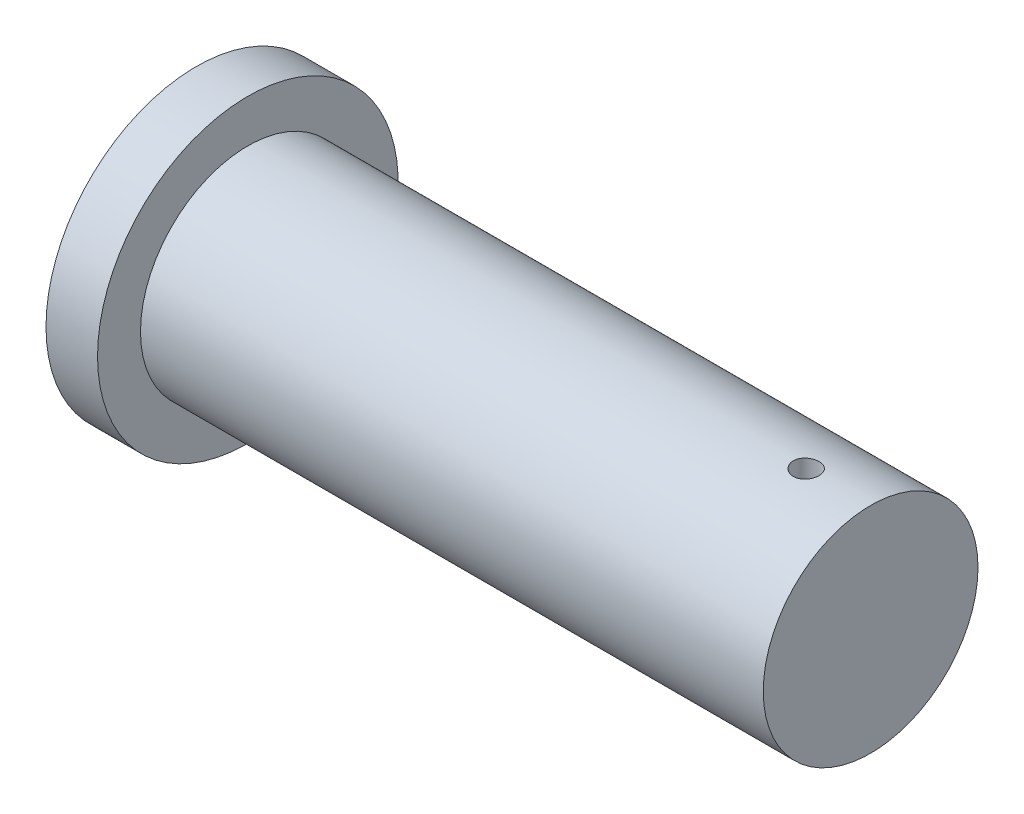
ISO-10303-21;
HEADER;
FILE_DESCRIPTION(('STEP AP214'),'2;1');
FILE_NAME('part.step','',(''),(''),'','','');
FILE_SCHEMA(('AUTOMOTIVE_DESIGN { 1 0 10303 214 1 1 1 1 }'));
ENDSEC;
DATA;
#1=APPLICATION_CONTEXT('core data for automotive mechanical design processes');
#2=APPLICATION_PROTOCOL_DEFINITION('international standard','automotive_design',2000,#1);
#3=PRODUCT_CONTEXT('',#1,'mechanical');
#4=PRODUCT('Part','Part','',(#3));
#5=PRODUCT_RELATED_PRODUCT_CATEGORY('part','',(#4));
#6=PRODUCT_DEFINITION_FORMATION('','',#4);
#7=PRODUCT_DEFINITION_CONTEXT('part definition',#1,'design');
#8=PRODUCT_DEFINITION('design','',#6,#7);
#9=PRODUCT_DEFINITION_SHAPE('','',#8);
#10=(LENGTH_UNIT() NAMED_UNIT(*) SI_UNIT(.MILLI.,.METRE.));
#11=(NAMED_UNIT(*) PLANE_ANGLE_UNIT() SI_UNIT($,.RADIAN.));
#12=(NAMED_UNIT(*) SI_UNIT($,.STERADIAN.) SOLID_ANGLE_UNIT());
#13=UNCERTAINTY_MEASURE_WITH_UNIT(LENGTH_MEASURE(1.E-05),#10,'distance_accuracy_value','');
#14=(GEOMETRIC_REPRESENTATION_CONTEXT(3) GLOBAL_UNCERTAINTY_ASSIGNED_CONTEXT((#13)) GLOBAL_UNIT_ASSIGNED_CONTEXT((#10,
#11,#12)) REPRESENTATION_CONTEXT('',''));
#15=CARTESIAN_POINT('',(0.,0.,0.));
#16=DIRECTION('',(0.,0.,1.));
#17=DIRECTION('',(1.,0.,0.));
#18=AXIS2_PLACEMENT_3D('',#15,#16,#17);
#19=CARTESIAN_POINT('',(-157.,35.,0.));
#20=DIRECTION('',(1.,0.,0.));
#21=DIRECTION('',(0.,0.,-1.));
#22=AXIS2_PLACEMENT_3D('',#19,#20,#21);
#23=PLANE('',#22);
#24=CARTESIAN_POINT('',(-157.,0.,0.));
#25=DIRECTION('',(-1.,0.,0.));
#26=DIRECTION('',(0.,0.,1.));
#27=AXIS2_PLACEMENT_3D('',#24,#25,#26);
#28=CIRCLE('',#27,35.);
#29=CARTESIAN_POINT('',(-157.,0.,35.));
#30=VERTEX_POINT('',#29);
#31=EDGE_CURVE('E90',#30,#30,#28,.T.);
#32=ORIENTED_EDGE('',*,*,#31,.T.);
#33=EDGE_LOOP('',(#32));
#34=FACE_BOUND('',#33,.T.);
#35=ADVANCED_FACE('F35',(#34),#23,.F.);
#36=CARTESIAN_POINT('',(0.,0.,0.));
#37=DIRECTION('',(-1.,0.,0.));
#38=DIRECTION('',(0.,0.,1.));
#39=AXIS2_PLACEMENT_3D('',#36,#37,#38);
#40=PLANE('',#39);
#41=CARTESIAN_POINT('',(0.,0.,0.));
#42=DIRECTION('',(-1.,0.,0.));
#43=DIRECTION('',(0.,0.,1.));
#44=AXIS2_PLACEMENT_3D('',#41,#42,#43);
#45=CIRCLE('',#44,25.);
#46=CARTESIAN_POINT('',(0.,0.,25.));
#47=VERTEX_POINT('',#46);
#48=EDGE_CURVE('E10',#47,#47,#45,.T.);
#49=ORIENTED_EDGE('',*,*,#48,.F.);
#50=EDGE_LOOP('',(#49));
#51=FACE_BOUND('',#50,.T.);
#52=ADVANCED_FACE('F78',(#51),#40,.F.);
#53=CARTESIAN_POINT('',(-157.,0.,0.));
#54=DIRECTION('',(-1.,0.,0.));
#55=DIRECTION('',(0.,0.,1.));
#56=AXIS2_PLACEMENT_3D('',#53,#54,#55);
#57=CYLINDRICAL_SURFACE('',#56,25.);
#58=CARTESIAN_POINT('',(-15.,-24.8193472919817,3.));
#59=CARTESIAN_POINT('',(-14.8321408588001,-24.819349617552,2.99999283172714));
#60=CARTESIAN_POINT('',(-14.6641754798501,-24.8210685774632,2.98586413495824));
#61=CARTESIAN_POINT('',(-14.3329153879421,-24.8277564496115,2.92972318709126));
#62=CARTESIAN_POINT('',(-14.1696258043137,-24.8327287982131,2.88768145238964));
#63=CARTESIAN_POINT('',(-13.8525615944955,-24.8453523109071,2.77696834616031));
#64=CARTESIAN_POINT('',(-13.6987807388663,-24.8530016988387,2.708314627898));
#65=CARTESIAN_POINT('',(-13.4049528578965,-24.8701152498661,2.5463633755789));
#66=CARTESIAN_POINT('',(-13.2649034084314,-24.8795790917656,2.45307020212001));
#67=CARTESIAN_POINT('',(-13.0017602283905,-24.8993100054925,2.24397143930053));
#68=CARTESIAN_POINT('',(-12.8787477056516,-24.9095805816582,2.1280639725065));
#69=CARTESIAN_POINT('',(-12.6538712818379,-24.9297361585383,1.87724586434875));
#70=CARTESIAN_POINT('',(-12.5520084140581,-24.9396211403948,1.74233429505413));
#71=CARTESIAN_POINT('',(-12.3720334670638,-24.9579274023081,1.45682956846799));
#72=CARTESIAN_POINT('',(-12.2939945842604,-24.9663441380671,1.30618995384899));
#73=CARTESIAN_POINT('',(-12.1643515396152,-24.9807271243236,0.993825767272774));
#74=CARTESIAN_POINT('',(-12.1127464702523,-24.9866934589465,0.832101576085541));
#75=CARTESIAN_POINT('',(-12.0376777438965,-24.9954787324527,0.502987856985083));
#76=CARTESIAN_POINT('',(-12.0140793465542,-24.9983127364408,0.335629471043379));
#77=CARTESIAN_POINT('',(-11.9952764006895,-25.0005654366101,-0.000694496668565301));
#78=CARTESIAN_POINT('',(-12.0000708178418,-24.9999842572034,-0.169660019668339));
#79=CARTESIAN_POINT('',(-12.0378091218513,-24.9954842925266,-0.50348566751753));
#80=CARTESIAN_POINT('',(-12.0706081049724,-24.9915826884338,-0.668362437568212));
#81=CARTESIAN_POINT('',(-12.163198151716,-24.9808996422381,-0.990254370091176));
#82=CARTESIAN_POINT('',(-12.2229896941816,-24.9741181490466,-1.1472693930426));
#83=CARTESIAN_POINT('',(-12.3680227289065,-24.9584077904553,-1.44943112325937));
#84=CARTESIAN_POINT('',(-12.4533272360064,-24.9494736188692,-1.59454729727538));
#85=CARTESIAN_POINT('',(-12.6469188989561,-24.9304580967161,-1.86845892019878));
#86=CARTESIAN_POINT('',(-12.7552070264156,-24.9203766976596,-1.99725367876689));
#87=CARTESIAN_POINT('',(-12.9925043495404,-24.9001206745296,-2.23571721123049));
#88=CARTESIAN_POINT('',(-13.1216397813735,-24.8899458632542,-2.34526038878379));
#89=CARTESIAN_POINT('',(-13.3965315136795,-24.8707126046074,-2.54113591825157));
#90=CARTESIAN_POINT('',(-13.5422878591645,-24.8616541602595,-2.62746820730526));
#91=CARTESIAN_POINT('',(-13.8463924901474,-24.8456792055215,-2.77447678358649));
#92=CARTESIAN_POINT('',(-14.0047454412579,-24.8387634934567,-2.83514351157641));
#93=CARTESIAN_POINT('',(-14.3294923595012,-24.8278728306611,-2.92899010032377));
#94=CARTESIAN_POINT('',(-14.4958859701193,-24.8238977496731,-2.96217117858551));
#95=CARTESIAN_POINT('',(-14.8308830963767,-24.8193620015637,-2.99993928712165));
#96=CARTESIAN_POINT('',(-14.9994664358811,-24.8187802560634,-3.00470284270772));
#97=CARTESIAN_POINT('',(-15.3350287808429,-24.8210413301146,-2.98596598055603));
#98=CARTESIAN_POINT('',(-15.5020078176874,-24.82388408253,-2.96246611691248));
#99=CARTESIAN_POINT('',(-15.829095783598,-24.8326546274978,-2.88801791942018));
#100=CARTESIAN_POINT('',(-15.9892243468093,-24.8385728602158,-2.83715462498937));
#101=CARTESIAN_POINT('',(-16.2986792829759,-24.8528197853248,-2.70951076792624));
#102=CARTESIAN_POINT('',(-16.448005304503,-24.8611485560914,-2.63272936258612));
#103=CARTESIAN_POINT('',(-16.7324162949746,-24.8793287313299,-2.45499302721611));
#104=CARTESIAN_POINT('',(-16.8674282868813,-24.8891873609855,-2.35392207141476));
#105=CARTESIAN_POINT('',(-17.1186351130118,-24.9092935540369,-2.13064017836707));
#106=CARTESIAN_POINT('',(-17.2348292734059,-24.9195411313438,-2.0084284844362));
#107=CARTESIAN_POINT('',(-17.4457197472349,-24.939335094491,-1.74556427266772));
#108=CARTESIAN_POINT('',(-17.5403002465114,-24.9488775256031,-1.60481849941783));
#109=CARTESIAN_POINT('',(-17.7044782093291,-24.966127243116,-1.30933642941058));
#110=CARTESIAN_POINT('',(-17.7740761423744,-24.9738345640038,-1.15460039564441));
#111=CARTESIAN_POINT('',(-17.8861210048758,-24.9865280430514,-0.835919244719985));
#112=CARTESIAN_POINT('',(-17.9286355198842,-24.9915209702628,-0.671998170647181));
#113=CARTESIAN_POINT('',(-17.9855267435821,-24.9982511364507,-0.339280584991476));
#114=CARTESIAN_POINT('',(-17.9999046166931,-24.9999885101567,-0.170484275461259));
#115=CARTESIAN_POINT('',(-18.0000938441123,-25.0000113048646,0.166060006255657));
#116=CARTESIAN_POINT('',(-17.9860840366832,-24.9983183365244,0.333807904658863));
#117=CARTESIAN_POINT('',(-17.9302735450975,-24.9917135402075,0.664547224796242));
#118=CARTESIAN_POINT('',(-17.8884728700504,-24.9868017132859,0.827538648089519));
#119=CARTESIAN_POINT('',(-17.7783219848685,-24.9743088019473,1.14411955598358));
#120=CARTESIAN_POINT('',(-17.7099796355458,-24.9667285079088,1.29771180874788));
#121=CARTESIAN_POINT('',(-17.5487039304153,-24.9497392443223,1.59127541052543));
#122=CARTESIAN_POINT('',(-17.4557703755962,-24.9403302599753,1.73124664929415));
#123=CARTESIAN_POINT('',(-17.2472863179947,-24.920663936203,1.99450948424813));
#124=CARTESIAN_POINT('',(-17.1316026446779,-24.910401817522,2.11769526787512));
#125=CARTESIAN_POINT('',(-16.8811769628439,-24.8902246865463,2.34297730712576));
#126=CARTESIAN_POINT('',(-16.7464304354851,-24.88030975725,2.44506854813713));
#127=CARTESIAN_POINT('',(-16.461157063841,-24.8619119204259,2.62557074728252));
#128=CARTESIAN_POINT('',(-16.3105756717734,-24.8534342444192,2.70389598198192));
#129=CARTESIAN_POINT('',(-15.9983822462959,-24.8389322365013,2.8340380582164));
#130=CARTESIAN_POINT('',(-15.8367825288144,-24.8329052161653,2.88588396425552));
#131=CARTESIAN_POINT('',(-15.5619404608884,-24.8254627238532,2.94907010073915));
#132=CARTESIAN_POINT('',(-15.4504372480377,-24.8231807309863,2.96814164942005));
#133=CARTESIAN_POINT('',(-15.2259720678681,-24.8201222373143,2.99360896909453));
#134=CARTESIAN_POINT('',(-15.1130101104407,-24.8193457263061,3.00000482599459));
#135=CARTESIAN_POINT('',(-15.,-24.8193472919817,3.));
#136=B_SPLINE_CURVE_WITH_KNOTS('',3,(#58,#59,#60,#61,#62,#63,#64,#65,#66,#67,#68,#69,#70,#71,
#72,#73,#74,#75,#76,#77,#78,#79,#80,#81,#82,#83,#84,#85,#86,#87,#88,#89,#90,#91,#92,#93,#94,#95,
#96,#97,#98,#99,#100,#101,#102,#103,#104,#105,#106,#107,#108,#109,#110,#111,#112,#113,#114,#115,
#116,#117,#118,#119,#120,#121,#122,#123,#124,#125,#126,#127,#128,#129,#130,#131,#132,#133,#134,
#135),.UNSPECIFIED.,.T.,.F.,(4,2,2,2,2,2,2,2,2,2,2,2,2,2,2,2,2,2,2,2,2,2,2,2,2,2,2,2,2,2,2,2,2,
2,2,2,2,2,4),(0.,0.503164613232923,1.00686154966524,1.51022492507114,2.01349927674882,
2.51909553323416,3.02471648549883,3.53187561756201,4.03901733675556,4.54370917218765,
5.04838262225285,5.55046046161349,6.05254720809332,6.55588445357932,7.05924298138498,
7.56577244411506,8.07230327863779,8.57902260679249,9.08571948810824,9.58926554088957,
10.0928017219916,10.5947819896887,11.0967785804672,11.6012225031328,12.105684484956,
12.6127892929794,13.119884570345,13.6257094034364,14.1315133027652,14.6341406188081,
15.1367677700954,15.6392461723566,16.1417286411941,16.6472450412647,17.1528814752089,
17.6603206216507,18.1672015841626,18.5059562893408,18.8447086986815),.UNSPECIFIED.);
#137=CARTESIAN_POINT('',(-15.,-24.8193472919817,3.));
#138=VERTEX_POINT('',#137);
#139=EDGE_CURVE('E38',#138,#138,#136,.T.);
#140=ORIENTED_EDGE('',*,*,#139,.T.);
#141=EDGE_LOOP('',(#140));
#142=FACE_BOUND('',#141,.T.);
#143=CARTESIAN_POINT('',(-15.,24.8193472919817,3.));
#144=CARTESIAN_POINT('',(-15.1678591411999,24.819349617552,2.99999283172714));
#145=CARTESIAN_POINT('',(-15.3358245201498,24.8210685774632,2.98586413495824));
#146=CARTESIAN_POINT('',(-15.6670846120579,24.8277564496115,2.92972318709126));
#147=CARTESIAN_POINT('',(-15.8303741956862,24.8327287982131,2.88768145238964));
#148=CARTESIAN_POINT('',(-16.1474384055045,24.8453523109071,2.77696834616031));
#149=CARTESIAN_POINT('',(-16.3012192611337,24.8530016988387,2.708314627898));
#150=CARTESIAN_POINT('',(-16.5950471421034,24.8701152498661,2.5463633755789));
#151=CARTESIAN_POINT('',(-16.7350965915686,24.8795790917656,2.45307020212001));
#152=CARTESIAN_POINT('',(-16.9982397716095,24.8993100054925,2.24397143930053));
#153=CARTESIAN_POINT('',(-17.1212522943484,24.9095805816582,2.1280639725065));
#154=CARTESIAN_POINT('',(-17.3461287181621,24.9297361585383,1.87724586434875));
#155=CARTESIAN_POINT('',(-17.4479915859418,24.9396211403948,1.74233429505413));
#156=CARTESIAN_POINT('',(-17.6279665329362,24.9579274023081,1.45682956846799));
#157=CARTESIAN_POINT('',(-17.7060054157396,24.9663441380671,1.30618995384899));
#158=CARTESIAN_POINT('',(-17.8356484603847,24.9807271243236,0.993825767272776));
#159=CARTESIAN_POINT('',(-17.8872535297477,24.9866934589465,0.832101576085543));
#160=CARTESIAN_POINT('',(-17.9623222561034,24.9954787324527,0.502987856985085));
#161=CARTESIAN_POINT('',(-17.9859206534458,24.9983127364408,0.335629471043381));
#162=CARTESIAN_POINT('',(-18.0047235993105,25.0005654366101,-0.000694496668564027));
#163=CARTESIAN_POINT('',(-17.9999291821582,24.9999842572034,-0.169660019668338));
#164=CARTESIAN_POINT('',(-17.9621908781486,24.9954842925266,-0.503485667517529));
#165=CARTESIAN_POINT('',(-17.9293918950276,24.9915826884338,-0.668362437568212));
#166=CARTESIAN_POINT('',(-17.836801848284,24.9808996422381,-0.990254370091175));
#167=CARTESIAN_POINT('',(-17.7770103058183,24.9741181490466,-1.1472693930426));
#168=CARTESIAN_POINT('',(-17.6319772710935,24.9584077904553,-1.44943112325937));
#169=CARTESIAN_POINT('',(-17.5466727639936,24.9494736188692,-1.59454729727538));
#170=CARTESIAN_POINT('',(-17.3530811010438,24.9304580967161,-1.86845892019878));
#171=CARTESIAN_POINT('',(-17.2447929735844,24.9203766976596,-1.99725367876689));
#172=CARTESIAN_POINT('',(-17.0074956504595,24.9001206745296,-2.23571721123049));
#173=CARTESIAN_POINT('',(-16.8783602186265,24.8899458632542,-2.34526038878379));
#174=CARTESIAN_POINT('',(-16.6034684863205,24.8707126046074,-2.54113591825157));
#175=CARTESIAN_POINT('',(-16.4577121408355,24.8616541602595,-2.62746820730525));
#176=CARTESIAN_POINT('',(-16.1536075098526,24.8456792055215,-2.77447678358649));
#177=CARTESIAN_POINT('',(-15.9952545587421,24.8387634934567,-2.83514351157641));
#178=CARTESIAN_POINT('',(-15.6705076404988,24.8278728306611,-2.92899010032377));
#179=CARTESIAN_POINT('',(-15.5041140298807,24.8238977496731,-2.96217117858551));
#180=CARTESIAN_POINT('',(-15.1691169036233,24.8193620015637,-2.99993928712165));
#181=CARTESIAN_POINT('',(-15.0005335641188,24.8187802560634,-3.00470284270772));
#182=CARTESIAN_POINT('',(-14.664971219157,24.8210413301146,-2.98596598055602));
#183=CARTESIAN_POINT('',(-14.4979921823126,24.82388408253,-2.96246611691248));
#184=CARTESIAN_POINT('',(-14.170904216402,24.8326546274978,-2.88801791942018));
#185=CARTESIAN_POINT('',(-14.0107756531907,24.8385728602158,-2.83715462498938));
#186=CARTESIAN_POINT('',(-13.701320717024,24.8528197853248,-2.70951076792624));
#187=CARTESIAN_POINT('',(-13.5519946954969,24.8611485560914,-2.63272936258612));
#188=CARTESIAN_POINT('',(-13.2675837050254,24.8793287313299,-2.45499302721611));
#189=CARTESIAN_POINT('',(-13.1325717131187,24.8891873609855,-2.35392207141476));
#190=CARTESIAN_POINT('',(-12.8813648869882,24.9092935540369,-2.13064017836707));
#191=CARTESIAN_POINT('',(-12.7651707265941,24.9195411313438,-2.0084284844362));
#192=CARTESIAN_POINT('',(-12.5542802527651,24.939335094491,-1.74556427266772));
#193=CARTESIAN_POINT('',(-12.4596997534886,24.9488775256031,-1.60481849941783));
#194=CARTESIAN_POINT('',(-12.2955217906709,24.966127243116,-1.30933642941058));
#195=CARTESIAN_POINT('',(-12.2259238576255,24.9738345640038,-1.15460039564442));
#196=CARTESIAN_POINT('',(-12.1138789951242,24.9865280430514,-0.835919244719987));
#197=CARTESIAN_POINT('',(-12.0713644801157,24.9915209702628,-0.671998170647183));
#198=CARTESIAN_POINT('',(-12.0144732564178,24.9982511364507,-0.339280584991479));
#199=CARTESIAN_POINT('',(-12.0000953833069,24.9999885101567,-0.17048427546126));
#200=CARTESIAN_POINT('',(-11.9999061558877,25.0000113048646,0.166060006255655));
#201=CARTESIAN_POINT('',(-12.0139159633167,24.9983183365244,0.333807904658862));
#202=CARTESIAN_POINT('',(-12.0697264549025,24.9917135402075,0.664547224796241));
#203=CARTESIAN_POINT('',(-12.1115271299496,24.9868017132859,0.827538648089518));
#204=CARTESIAN_POINT('',(-12.2216780151315,24.9743088019473,1.14411955598358));
#205=CARTESIAN_POINT('',(-12.2900203644542,24.9667285079088,1.29771180874788));
#206=CARTESIAN_POINT('',(-12.4512960695847,24.9497392443223,1.59127541052543));
#207=CARTESIAN_POINT('',(-12.5442296244038,24.9403302599753,1.73124664929415));
#208=CARTESIAN_POINT('',(-12.7527136820053,24.920663936203,1.99450948424813));
#209=CARTESIAN_POINT('',(-12.8683973553221,24.910401817522,2.11769526787512));
#210=CARTESIAN_POINT('',(-13.1188230371561,24.8902246865463,2.34297730712576));
#211=CARTESIAN_POINT('',(-13.2535695645149,24.88030975725,2.44506854813713));
#212=CARTESIAN_POINT('',(-13.538842936159,24.8619119204259,2.62557074728252));
#213=CARTESIAN_POINT('',(-13.6894243282266,24.8534342444192,2.70389598198192));
#214=CARTESIAN_POINT('',(-14.001617753704,24.8389322365013,2.8340380582164));
#215=CARTESIAN_POINT('',(-14.1632174711855,24.8329052161653,2.88588396425552));
#216=CARTESIAN_POINT('',(-14.4380595391116,24.8254627238532,2.94907010073915));
#217=CARTESIAN_POINT('',(-14.5495627519623,24.8231807309863,2.96814164942005));
#218=CARTESIAN_POINT('',(-14.7740279321319,24.8201222373143,2.99360896909453));
#219=CARTESIAN_POINT('',(-14.8869898895593,24.8193457263061,3.00000482599459));
#220=CARTESIAN_POINT('',(-15.,24.8193472919817,3.));
#221=B_SPLINE_CURVE_WITH_KNOTS('',3,(#143,#144,#145,#146,#147,#148,#149,#150,#151,#152,#153,
#154,#155,#156,#157,#158,#159,#160,#161,#162,#163,#164,#165,#166,#167,#168,#169,#170,#171,#172,
#173,#174,#175,#176,#177,#178,#179,#180,#181,#182,#183,#184,#185,#186,#187,#188,#189,#190,#191,
#192,#193,#194,#195,#196,#197,#198,#199,#200,#201,#202,#203,#204,#205,#206,#207,#208,#209,#210,
#211,#212,#213,#214,#215,#216,#217,#218,#219,#220),.UNSPECIFIED.,.T.,.F.,(4,2,2,2,2,2,2,2,2,2,2,
2,2,2,2,2,2,2,2,2,2,2,2,2,2,2,2,2,2,2,2,2,2,2,2,2,2,2,4),(0.,0.503164613232923,1.00686154966524,
1.51022492507114,2.01349927674882,2.51909553323415,3.02471648549882,3.531875617562,
4.03901733675556,4.54370917218765,5.04838262225285,5.55046046161349,6.05254720809332,
6.55588445357932,7.05924298138498,7.56577244411505,8.07230327863779,8.57902260679249,
9.08571948810824,9.58926554088957,10.0928017219916,10.5947819896887,11.0967785804672,
11.6012225031328,12.105684484956,12.6127892929794,13.119884570345,13.6257094034364,
14.1315133027652,14.6341406188081,15.1367677700954,15.6392461723566,16.1417286411941,
16.6472450412647,17.1528814752089,17.6603206216507,18.1672015841626,18.5059562893408,
18.8447086986815),.UNSPECIFIED.);
#222=CARTESIAN_POINT('',(-15.,24.8193472919817,3.));
#223=VERTEX_POINT('',#222);
#224=EDGE_CURVE('E55',#223,#223,#221,.T.);
#225=ORIENTED_EDGE('',*,*,#224,.T.);
#226=EDGE_LOOP('',(#225));
#227=FACE_BOUND('',#226,.T.);
#228=CARTESIAN_POINT('',(-145.,0.,0.));
#229=DIRECTION('',(-1.,0.,0.));
#230=DIRECTION('',(0.,0.,1.));
#231=AXIS2_PLACEMENT_3D('',#228,#229,#230);
#232=CIRCLE('',#231,25.);
#233=CARTESIAN_POINT('',(-145.,0.,25.));
#234=VERTEX_POINT('',#233);
#235=EDGE_CURVE('E47',#234,#234,#232,.T.);
#236=ORIENTED_EDGE('',*,*,#235,.F.);
#237=EDGE_LOOP('',(#236));
#238=FACE_BOUND('',#237,.T.);
#239=ORIENTED_EDGE('',*,*,#48,.T.);
#240=EDGE_LOOP('',(#239));
#241=FACE_BOUND('',#240,.T.);
#242=ADVANCED_FACE('F60',(#142,#227,#238,#241),#57,.T.);
#243=CARTESIAN_POINT('',(-145.,25.,0.));
#244=DIRECTION('',(-1.,0.,0.));
#245=DIRECTION('',(0.,0.,1.));
#246=AXIS2_PLACEMENT_3D('',#243,#244,#245);
#247=PLANE('',#246);
#248=CARTESIAN_POINT('',(-145.,0.,0.));
#249=DIRECTION('',(-1.,0.,0.));
#250=DIRECTION('',(0.,0.,1.));
#251=AXIS2_PLACEMENT_3D('',#248,#249,#250);
#252=CIRCLE('',#251,35.);
#253=CARTESIAN_POINT('',(-145.,0.,35.));
#254=VERTEX_POINT('',#253);
#255=EDGE_CURVE('E52',#254,#254,#252,.T.);
#256=ORIENTED_EDGE('',*,*,#255,.F.);
#257=EDGE_LOOP('',(#256));
#258=FACE_BOUND('',#257,.T.);
#259=ORIENTED_EDGE('',*,*,#235,.T.);
#260=EDGE_LOOP('',(#259));
#261=FACE_BOUND('',#260,.T.);
#262=ADVANCED_FACE('F71',(#258,#261),#247,.F.);
#263=CARTESIAN_POINT('',(-157.,0.,0.));
#264=DIRECTION('',(-1.,0.,0.));
#265=DIRECTION('',(0.,0.,1.));
#266=AXIS2_PLACEMENT_3D('',#263,#264,#265);
#267=CYLINDRICAL_SURFACE('',#266,35.);
#268=ORIENTED_EDGE('',*,*,#31,.F.);
#269=EDGE_LOOP('',(#268));
#270=FACE_BOUND('',#269,.T.);
#271=ORIENTED_EDGE('',*,*,#255,.T.);
#272=EDGE_LOOP('',(#271));
#273=FACE_BOUND('',#272,.T.);
#274=ADVANCED_FACE('F67',(#270,#273),#267,.T.);
#275=CARTESIAN_POINT('',(-15.,-35.,0.));
#276=DIRECTION('',(0.,1.,0.));
#277=DIRECTION('',(0.,0.,1.));
#278=AXIS2_PLACEMENT_3D('',#275,#276,#277);
#279=CYLINDRICAL_SURFACE('',#278,3.);
#280=ORIENTED_EDGE('',*,*,#224,.F.);
#281=EDGE_LOOP('',(#280));
#282=FACE_BOUND('',#281,.T.);
#283=ORIENTED_EDGE('',*,*,#139,.F.);
#284=EDGE_LOOP('',(#283));
#285=FACE_BOUND('',#284,.T.);
#286=ADVANCED_FACE('F63',(#282,#285),#279,.F.);
#287=CLOSED_SHELL('',(#35,#52,#242,#262,#274,#286));
#288=MANIFOLD_SOLID_BREP('B2',#287);
#289=ADVANCED_BREP_SHAPE_REPRESENTATION('',(#18,#288),#14);
#290=SHAPE_DEFINITION_REPRESENTATION(#9,#289);
ENDSEC;
END-ISO-10303-21;
